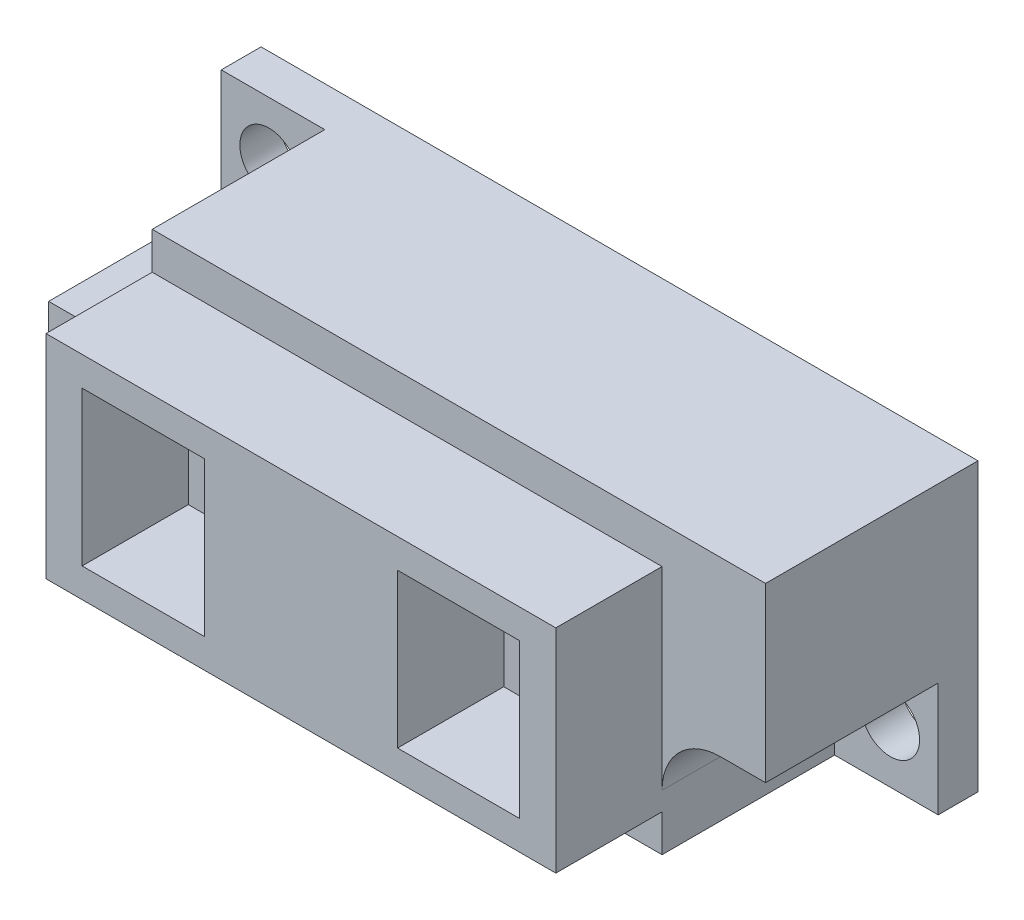
ISO-10303-21;
HEADER;
FILE_DESCRIPTION(('STEP AP214'),'2;1');
FILE_NAME('part.step','',(''),(''),'','','');
FILE_SCHEMA(('AUTOMOTIVE_DESIGN { 1 0 10303 214 1 1 1 1 }'));
ENDSEC;
DATA;
#1=APPLICATION_CONTEXT('core data for automotive mechanical design processes');
#2=APPLICATION_PROTOCOL_DEFINITION('international standard','automotive_design',2000,#1);
#3=PRODUCT_CONTEXT('',#1,'mechanical');
#4=PRODUCT('Part','Part','',(#3));
#5=PRODUCT_RELATED_PRODUCT_CATEGORY('part','',(#4));
#6=PRODUCT_DEFINITION_FORMATION('','',#4);
#7=PRODUCT_DEFINITION_CONTEXT('part definition',#1,'design');
#8=PRODUCT_DEFINITION('design','',#6,#7);
#9=PRODUCT_DEFINITION_SHAPE('','',#8);
#10=(LENGTH_UNIT() NAMED_UNIT(*) SI_UNIT(.MILLI.,.METRE.));
#11=(NAMED_UNIT(*) PLANE_ANGLE_UNIT() SI_UNIT($,.RADIAN.));
#12=(NAMED_UNIT(*) SI_UNIT($,.STERADIAN.) SOLID_ANGLE_UNIT());
#13=UNCERTAINTY_MEASURE_WITH_UNIT(LENGTH_MEASURE(1.E-05),#10,'distance_accuracy_value','');
#14=(GEOMETRIC_REPRESENTATION_CONTEXT(3) GLOBAL_UNCERTAINTY_ASSIGNED_CONTEXT((#13)) GLOBAL_UNIT_ASSIGNED_CONTEXT((#10,
#11,#12)) REPRESENTATION_CONTEXT('',''));
#15=CARTESIAN_POINT('',(0.,0.,0.));
#16=DIRECTION('',(0.,0.,1.));
#17=DIRECTION('',(1.,0.,0.));
#18=AXIS2_PLACEMENT_3D('',#15,#16,#17);
#19=CARTESIAN_POINT('',(0.,0.,12.));
#20=DIRECTION('',(0.,0.,-1.));
#21=DIRECTION('',(-1.,0.,0.));
#22=AXIS2_PLACEMENT_3D('',#19,#20,#21);
#23=PLANE('',#22);
#24=DIRECTION('',(-1.,0.,0.));
#25=VECTOR('',#24,1.);
#26=CARTESIAN_POINT('',(-8.24,2.9,12.));
#27=LINE('',#26,#25);
#28=CARTESIAN_POINT('',(-3.64,2.9,12.));
#29=VERTEX_POINT('',#28);
#30=CARTESIAN_POINT('',(-8.24,2.9,12.));
#31=VERTEX_POINT('',#30);
#32=EDGE_CURVE('E309',#29,#31,#27,.T.);
#33=ORIENTED_EDGE('',*,*,#32,.F.);
#34=DIRECTION('',(0.,1.,0.));
#35=VECTOR('',#34,1.);
#36=CARTESIAN_POINT('',(-3.64,-2.9,12.));
#37=LINE('',#36,#35);
#38=CARTESIAN_POINT('',(-3.64,-2.9,12.));
#39=VERTEX_POINT('',#38);
#40=EDGE_CURVE('E65',#39,#29,#37,.T.);
#41=ORIENTED_EDGE('',*,*,#40,.F.);
#42=DIRECTION('',(1.,0.,0.));
#43=VECTOR('',#42,1.);
#44=CARTESIAN_POINT('',(-8.24,-2.9,12.));
#45=LINE('',#44,#43);
#46=CARTESIAN_POINT('',(-8.24,-2.9,12.));
#47=VERTEX_POINT('',#46);
#48=EDGE_CURVE('E294',#47,#39,#45,.T.);
#49=ORIENTED_EDGE('',*,*,#48,.F.);
#50=DIRECTION('',(0.,-1.,0.));
#51=VECTOR('',#50,1.);
#52=CARTESIAN_POINT('',(-8.24,-2.9,12.));
#53=LINE('',#52,#51);
#54=EDGE_CURVE('E314',#31,#47,#53,.T.);
#55=ORIENTED_EDGE('',*,*,#54,.F.);
#56=EDGE_LOOP('',(#33,#41,#49,#55));
#57=FACE_BOUND('',#56,.T.);
#58=DIRECTION('',(-1.,0.,0.));
#59=VECTOR('',#58,1.);
#60=CARTESIAN_POINT('',(3.64,2.9,12.));
#61=LINE('',#60,#59);
#62=CARTESIAN_POINT('',(8.24,2.9,12.));
#63=VERTEX_POINT('',#62);
#64=CARTESIAN_POINT('',(3.64,2.9,12.));
#65=VERTEX_POINT('',#64);
#66=EDGE_CURVE('E353',#63,#65,#61,.T.);
#67=ORIENTED_EDGE('',*,*,#66,.F.);
#68=DIRECTION('',(0.,1.,0.));
#69=VECTOR('',#68,1.);
#70=CARTESIAN_POINT('',(8.24,-2.9,12.));
#71=LINE('',#70,#69);
#72=CARTESIAN_POINT('',(8.24,-2.9,12.));
#73=VERTEX_POINT('',#72);
#74=EDGE_CURVE('E281',#73,#63,#71,.T.);
#75=ORIENTED_EDGE('',*,*,#74,.F.);
#76=DIRECTION('',(1.,0.,0.));
#77=VECTOR('',#76,1.);
#78=CARTESIAN_POINT('',(3.64,-2.9,12.));
#79=LINE('',#78,#77);
#80=CARTESIAN_POINT('',(3.64,-2.9,12.));
#81=VERTEX_POINT('',#80);
#82=EDGE_CURVE('E338',#81,#73,#79,.T.);
#83=ORIENTED_EDGE('',*,*,#82,.F.);
#84=DIRECTION('',(0.,-1.,0.));
#85=VECTOR('',#84,1.);
#86=CARTESIAN_POINT('',(3.64,-2.9,12.));
#87=LINE('',#86,#85);
#88=EDGE_CURVE('E357',#65,#81,#87,.T.);
#89=ORIENTED_EDGE('',*,*,#88,.F.);
#90=EDGE_LOOP('',(#67,#75,#83,#89));
#91=FACE_BOUND('',#90,.T.);
#92=DIRECTION('',(1.,0.,0.));
#93=VECTOR('',#92,1.);
#94=CARTESIAN_POINT('',(-9.6,-4.,12.));
#95=LINE('',#94,#93);
#96=CARTESIAN_POINT('',(-9.6,-4.,12.));
#97=VERTEX_POINT('',#96);
#98=CARTESIAN_POINT('',(9.6,-4.,12.));
#99=VERTEX_POINT('',#98);
#100=EDGE_CURVE('E379',#97,#99,#95,.T.);
#101=ORIENTED_EDGE('',*,*,#100,.T.);
#102=DIRECTION('',(0.,-1.,0.));
#103=VECTOR('',#102,1.);
#104=CARTESIAN_POINT('',(9.6,-5.4,12.));
#105=LINE('',#104,#103);
#106=CARTESIAN_POINT('',(9.6,4.,12.));
#107=VERTEX_POINT('',#106);
#108=EDGE_CURVE('E441',#107,#99,#105,.T.);
#109=ORIENTED_EDGE('',*,*,#108,.F.);
#110=DIRECTION('',(-1.,0.,0.));
#111=VECTOR('',#110,1.);
#112=CARTESIAN_POINT('',(-9.6,4.,12.));
#113=LINE('',#112,#111);
#114=CARTESIAN_POINT('',(-9.6,4.,12.));
#115=VERTEX_POINT('',#114);
#116=EDGE_CURVE('E324',#107,#115,#113,.T.);
#117=ORIENTED_EDGE('',*,*,#116,.T.);
#118=DIRECTION('',(0.,1.,0.));
#119=VECTOR('',#118,1.);
#120=CARTESIAN_POINT('',(-9.59999999999999,5.4,12.));
#121=LINE('',#120,#119);
#122=EDGE_CURVE('E447',#97,#115,#121,.T.);
#123=ORIENTED_EDGE('',*,*,#122,.F.);
#124=EDGE_LOOP('',(#101,#109,#117,#123));
#125=FACE_BOUND('',#124,.T.);
#126=ADVANCED_FACE('F41',(#57,#91,#125),#23,.F.);
#127=CARTESIAN_POINT('',(-11.7,3.3,0.));
#128=DIRECTION('',(0.,0.,1.));
#129=DIRECTION('',(1.,0.,0.));
#130=AXIS2_PLACEMENT_3D('',#127,#128,#129);
#131=CYLINDRICAL_SURFACE('',#130,1.1);
#132=CARTESIAN_POINT('',(-11.7,3.3,0.));
#133=DIRECTION('',(0.,0.,1.));
#134=DIRECTION('',(1.,0.,0.));
#135=AXIS2_PLACEMENT_3D('',#132,#133,#134);
#136=CIRCLE('',#135,1.1);
#137=CARTESIAN_POINT('',(-10.6,3.3,0.));
#138=VERTEX_POINT('',#137);
#139=EDGE_CURVE('E520',#138,#138,#136,.T.);
#140=ORIENTED_EDGE('',*,*,#139,.F.);
#141=EDGE_LOOP('',(#140));
#142=FACE_BOUND('',#141,.T.);
#143=CARTESIAN_POINT('',(-11.7,3.3,1.5));
#144=DIRECTION('',(0.,0.,1.));
#145=DIRECTION('',(1.,0.,0.));
#146=AXIS2_PLACEMENT_3D('',#143,#144,#145);
#147=CIRCLE('',#146,1.1);
#148=CARTESIAN_POINT('',(-10.6,3.3,1.5));
#149=VERTEX_POINT('',#148);
#150=EDGE_CURVE('E471',#149,#149,#147,.F.);
#151=ORIENTED_EDGE('',*,*,#150,.F.);
#152=EDGE_LOOP('',(#151));
#153=FACE_BOUND('',#152,.T.);
#154=ADVANCED_FACE('F582',(#142,#153),#131,.F.);
#155=CARTESIAN_POINT('',(-13.5,-5.4,12.));
#156=DIRECTION('',(-1.,0.,0.));
#157=DIRECTION('',(0.,0.,1.));
#158=AXIS2_PLACEMENT_3D('',#155,#156,#157);
#159=PLANE('',#158);
#160=DIRECTION('',(0.,-1.,0.));
#161=VECTOR('',#160,1.);
#162=CARTESIAN_POINT('',(-13.5,-5.4,8.));
#163=LINE('',#162,#161);
#164=CARTESIAN_POINT('',(-13.5,1.1,8.));
#165=VERTEX_POINT('',#164);
#166=CARTESIAN_POINT('',(-13.5,-5.4,8.));
#167=VERTEX_POINT('',#166);
#168=EDGE_CURVE('E415',#165,#167,#163,.T.);
#169=ORIENTED_EDGE('',*,*,#168,.F.);
#170=DIRECTION('',(0.,0.,1.));
#171=VECTOR('',#170,1.);
#172=CARTESIAN_POINT('',(-13.5,1.1,1.5));
#173=LINE('',#172,#171);
#174=CARTESIAN_POINT('',(-13.5,1.1,1.5));
#175=VERTEX_POINT('',#174);
#176=EDGE_CURVE('E462',#175,#165,#173,.T.);
#177=ORIENTED_EDGE('',*,*,#176,.F.);
#178=DIRECTION('',(0.,-1.,0.));
#179=VECTOR('',#178,1.);
#180=CARTESIAN_POINT('',(-13.5,5.4,1.5));
#181=LINE('',#180,#179);
#182=CARTESIAN_POINT('',(-13.5,5.4,1.5));
#183=VERTEX_POINT('',#182);
#184=EDGE_CURVE('E442',#183,#175,#181,.T.);
#185=ORIENTED_EDGE('',*,*,#184,.F.);
#186=DIRECTION('',(0.,0.,-1.));
#187=VECTOR('',#186,1.);
#188=CARTESIAN_POINT('',(-13.5,5.4,12.));
#189=LINE('',#188,#187);
#190=CARTESIAN_POINT('',(-13.5,5.4,0.));
#191=VERTEX_POINT('',#190);
#192=EDGE_CURVE('E543',#183,#191,#189,.T.);
#193=ORIENTED_EDGE('',*,*,#192,.T.);
#194=DIRECTION('',(0.,1.,0.));
#195=VECTOR('',#194,1.);
#196=CARTESIAN_POINT('',(-13.5,-5.4,0.));
#197=LINE('',#196,#195);
#198=CARTESIAN_POINT('',(-13.5,-5.4,0.));
#199=VERTEX_POINT('',#198);
#200=EDGE_CURVE('E237',#199,#191,#197,.T.);
#201=ORIENTED_EDGE('',*,*,#200,.F.);
#202=DIRECTION('',(0.,0.,-1.));
#203=VECTOR('',#202,1.);
#204=CARTESIAN_POINT('',(-13.5,-5.4,4.));
#205=LINE('',#204,#203);
#206=CARTESIAN_POINT('',(-13.5,-5.4,-2.6));
#207=VERTEX_POINT('',#206);
#208=EDGE_CURVE('E231',#199,#207,#205,.T.);
#209=ORIENTED_EDGE('',*,*,#208,.T.);
#210=DIRECTION('',(0.,1.,0.));
#211=VECTOR('',#210,1.);
#212=CARTESIAN_POINT('',(-13.5,-5.4,-2.6));
#213=LINE('',#212,#211);
#214=CARTESIAN_POINT('',(-13.5,-7.8,-2.6));
#215=VERTEX_POINT('',#214);
#216=EDGE_CURVE('E235',#215,#207,#213,.T.);
#217=ORIENTED_EDGE('',*,*,#216,.F.);
#218=DIRECTION('',(0.,0.,-1.));
#219=VECTOR('',#218,1.);
#220=CARTESIAN_POINT('',(-13.5,-7.8,4.));
#221=LINE('',#220,#219);
#222=CARTESIAN_POINT('',(-13.5,-7.8,4.));
#223=VERTEX_POINT('',#222);
#224=EDGE_CURVE('E278',#223,#215,#221,.T.);
#225=ORIENTED_EDGE('',*,*,#224,.F.);
#226=DIRECTION('',(0.,1.,0.));
#227=VECTOR('',#226,1.);
#228=CARTESIAN_POINT('',(-13.5,-5.4,4.));
#229=LINE('',#228,#227);
#230=CARTESIAN_POINT('',(-13.5,-5.4,4.));
#231=VERTEX_POINT('',#230);
#232=EDGE_CURVE('E265',#223,#231,#229,.T.);
#233=ORIENTED_EDGE('',*,*,#232,.T.);
#234=DIRECTION('',(0.,0.,-1.));
#235=VECTOR('',#234,1.);
#236=CARTESIAN_POINT('',(-13.5,-5.4,12.));
#237=LINE('',#236,#235);
#238=EDGE_CURVE('E50',#167,#231,#237,.T.);
#239=ORIENTED_EDGE('',*,*,#238,.F.);
#240=EDGE_LOOP('',(#169,#177,#185,#193,#201,#209,#217,#225,#233,#239));
#241=FACE_BOUND('',#240,.T.);
#242=ADVANCED_FACE('F43',(#241),#159,.T.);
#243=CARTESIAN_POINT('',(-13.5,-5.4,12.));
#244=DIRECTION('',(0.,1.,0.));
#245=DIRECTION('',(0.,0.,1.));
#246=AXIS2_PLACEMENT_3D('',#243,#244,#245);
#247=PLANE('',#246);
#248=DIRECTION('',(1.,0.,0.));
#249=VECTOR('',#248,1.);
#250=CARTESIAN_POINT('',(-13.5,-5.4,4.));
#251=LINE('',#250,#249);
#252=CARTESIAN_POINT('',(-3.65,-5.4,4.));
#253=VERTEX_POINT('',#252);
#254=EDGE_CURVE('E269',#231,#253,#251,.T.);
#255=ORIENTED_EDGE('',*,*,#254,.T.);
#256=DIRECTION('',(0.,0.,-1.));
#257=VECTOR('',#256,1.);
#258=CARTESIAN_POINT('',(-3.65,-5.4,4.));
#259=LINE('',#258,#257);
#260=CARTESIAN_POINT('',(-3.65,-5.4,0.));
#261=VERTEX_POINT('',#260);
#262=EDGE_CURVE('E285',#253,#261,#259,.T.);
#263=ORIENTED_EDGE('',*,*,#262,.T.);
#264=DIRECTION('',(1.,0.,0.));
#265=VECTOR('',#264,1.);
#266=CARTESIAN_POINT('',(-13.5,-5.4,0.));
#267=LINE('',#266,#265);
#268=CARTESIAN_POINT('',(13.5,-5.4,0.));
#269=VERTEX_POINT('',#268);
#270=EDGE_CURVE('E539',#261,#269,#267,.T.);
#271=ORIENTED_EDGE('',*,*,#270,.T.);
#272=DIRECTION('',(0.,0.,-1.));
#273=VECTOR('',#272,1.);
#274=CARTESIAN_POINT('',(13.5,-5.4,12.));
#275=LINE('',#274,#273);
#276=CARTESIAN_POINT('',(13.5,-5.4,1.5));
#277=VERTEX_POINT('',#276);
#278=EDGE_CURVE('E547',#277,#269,#275,.T.);
#279=ORIENTED_EDGE('',*,*,#278,.F.);
#280=DIRECTION('',(1.,0.,0.));
#281=VECTOR('',#280,1.);
#282=CARTESIAN_POINT('',(9.6,-5.4,1.5));
#283=LINE('',#282,#281);
#284=CARTESIAN_POINT('',(9.6,-5.4,1.5));
#285=VERTEX_POINT('',#284);
#286=EDGE_CURVE('E499',#285,#277,#283,.T.);
#287=ORIENTED_EDGE('',*,*,#286,.F.);
#288=DIRECTION('',(0.,0.,1.));
#289=VECTOR('',#288,1.);
#290=CARTESIAN_POINT('',(9.6,-5.4,1.5));
#291=LINE('',#290,#289);
#292=CARTESIAN_POINT('',(9.6,-5.4,8.));
#293=VERTEX_POINT('',#292);
#294=EDGE_CURVE('E466',#285,#293,#291,.T.);
#295=ORIENTED_EDGE('',*,*,#294,.T.);
#296=DIRECTION('',(1.,0.,0.));
#297=VECTOR('',#296,1.);
#298=CARTESIAN_POINT('',(-13.5,-5.4,8.));
#299=LINE('',#298,#297);
#300=EDGE_CURVE('E418',#167,#293,#299,.T.);
#301=ORIENTED_EDGE('',*,*,#300,.F.);
#302=ORIENTED_EDGE('',*,*,#238,.T.);
#303=EDGE_LOOP('',(#255,#263,#271,#279,#287,#295,#301,#302));
#304=FACE_BOUND('',#303,.T.);
#305=ADVANCED_FACE('F599',(#304),#247,.F.);
#306=CARTESIAN_POINT('',(13.5,-5.4,12.));
#307=DIRECTION('',(-1.,0.,0.));
#308=DIRECTION('',(0.,0.,1.));
#309=AXIS2_PLACEMENT_3D('',#306,#307,#308);
#310=PLANE('',#309);
#311=DIRECTION('',(0.,0.,-1.));
#312=VECTOR('',#311,1.);
#313=CARTESIAN_POINT('',(13.5,5.4,12.));
#314=LINE('',#313,#312);
#315=CARTESIAN_POINT('',(13.5,5.4,8.));
#316=VERTEX_POINT('',#315);
#317=CARTESIAN_POINT('',(13.5,5.4,0.));
#318=VERTEX_POINT('',#317);
#319=EDGE_CURVE('E551',#316,#318,#314,.T.);
#320=ORIENTED_EDGE('',*,*,#319,.F.);
#321=DIRECTION('',(0.,1.,0.));
#322=VECTOR('',#321,1.);
#323=CARTESIAN_POINT('',(13.5,-5.4,8.));
#324=LINE('',#323,#322);
#325=CARTESIAN_POINT('',(13.5,-1.1,8.));
#326=VERTEX_POINT('',#325);
#327=EDGE_CURVE('E399',#326,#316,#324,.T.);
#328=ORIENTED_EDGE('',*,*,#327,.F.);
#329=DIRECTION('',(0.,0.,1.));
#330=VECTOR('',#329,1.);
#331=CARTESIAN_POINT('',(13.5,-1.1,1.5));
#332=LINE('',#331,#330);
#333=CARTESIAN_POINT('',(13.5,-1.1,1.5));
#334=VERTEX_POINT('',#333);
#335=EDGE_CURVE('E502',#334,#326,#332,.T.);
#336=ORIENTED_EDGE('',*,*,#335,.F.);
#337=DIRECTION('',(0.,1.,0.));
#338=VECTOR('',#337,1.);
#339=CARTESIAN_POINT('',(13.5,-1.1,1.5));
#340=LINE('',#339,#338);
#341=EDGE_CURVE('E483',#277,#334,#340,.T.);
#342=ORIENTED_EDGE('',*,*,#341,.F.);
#343=ORIENTED_EDGE('',*,*,#278,.T.);
#344=DIRECTION('',(0.,1.,0.));
#345=VECTOR('',#344,1.);
#346=CARTESIAN_POINT('',(13.5,-5.4,0.));
#347=LINE('',#346,#345);
#348=EDGE_CURVE('E535',#269,#318,#347,.T.);
#349=ORIENTED_EDGE('',*,*,#348,.T.);
#350=EDGE_LOOP('',(#320,#328,#336,#342,#343,#349));
#351=FACE_BOUND('',#350,.T.);
#352=ADVANCED_FACE('F602',(#351),#310,.F.);
#353=CARTESIAN_POINT('',(-13.5,5.4,12.));
#354=DIRECTION('',(0.,1.,0.));
#355=DIRECTION('',(0.,0.,1.));
#356=AXIS2_PLACEMENT_3D('',#353,#354,#355);
#357=PLANE('',#356);
#358=DIRECTION('',(-1.,0.,0.));
#359=VECTOR('',#358,1.);
#360=CARTESIAN_POINT('',(-13.5,5.4,8.));
#361=LINE('',#360,#359);
#362=CARTESIAN_POINT('',(-9.59999999999999,5.4,8.));
#363=VERTEX_POINT('',#362);
#364=EDGE_CURVE('E412',#316,#363,#361,.T.);
#365=ORIENTED_EDGE('',*,*,#364,.F.);
#366=ORIENTED_EDGE('',*,*,#319,.T.);
#367=DIRECTION('',(1.,0.,0.));
#368=VECTOR('',#367,1.);
#369=CARTESIAN_POINT('',(-13.5,5.4,0.));
#370=LINE('',#369,#368);
#371=EDGE_CURVE('E531',#191,#318,#370,.T.);
#372=ORIENTED_EDGE('',*,*,#371,.F.);
#373=ORIENTED_EDGE('',*,*,#192,.F.);
#374=DIRECTION('',(-1.,0.,0.));
#375=VECTOR('',#374,1.);
#376=CARTESIAN_POINT('',(-9.59999999999999,5.4,1.5));
#377=LINE('',#376,#375);
#378=CARTESIAN_POINT('',(-9.59999999999999,5.4,1.5));
#379=VERTEX_POINT('',#378);
#380=EDGE_CURVE('E459',#379,#183,#377,.T.);
#381=ORIENTED_EDGE('',*,*,#380,.F.);
#382=DIRECTION('',(0.,0.,1.));
#383=VECTOR('',#382,1.);
#384=CARTESIAN_POINT('',(-9.59999999999999,5.4,1.5));
#385=LINE('',#384,#383);
#386=EDGE_CURVE('E467',#379,#363,#385,.T.);
#387=ORIENTED_EDGE('',*,*,#386,.T.);
#388=EDGE_LOOP('',(#365,#366,#372,#373,#381,#387));
#389=FACE_BOUND('',#388,.T.);
#390=ADVANCED_FACE('F597',(#389),#357,.T.);
#391=CARTESIAN_POINT('',(0.,0.,0.));
#392=DIRECTION('',(0.,0.,-1.));
#393=DIRECTION('',(-1.,0.,0.));
#394=AXIS2_PLACEMENT_3D('',#391,#392,#393);
#395=PLANE('',#394);
#396=ORIENTED_EDGE('',*,*,#139,.T.);
#397=EDGE_LOOP('',(#396));
#398=FACE_BOUND('',#397,.T.);
#399=CARTESIAN_POINT('',(11.7,-3.3,0.));
#400=DIRECTION('',(0.,0.,1.));
#401=DIRECTION('',(1.,0.,0.));
#402=AXIS2_PLACEMENT_3D('',#399,#400,#401);
#403=CIRCLE('',#402,1.1);
#404=CARTESIAN_POINT('',(12.8,-3.3,0.));
#405=VERTEX_POINT('',#404);
#406=EDGE_CURVE('E524',#405,#405,#403,.T.);
#407=ORIENTED_EDGE('',*,*,#406,.T.);
#408=EDGE_LOOP('',(#407));
#409=FACE_BOUND('',#408,.T.);
#410=ORIENTED_EDGE('',*,*,#200,.T.);
#411=ORIENTED_EDGE('',*,*,#371,.T.);
#412=ORIENTED_EDGE('',*,*,#348,.F.);
#413=ORIENTED_EDGE('',*,*,#270,.F.);
#414=EDGE_CURVE('E540',#199,#261,#267,.T.);
#415=ORIENTED_EDGE('',*,*,#414,.F.);
#416=EDGE_LOOP('',(#410,#411,#412,#413,#415));
#417=FACE_BOUND('',#416,.T.);
#418=ADVANCED_FACE('F594',(#398,#409,#417),#395,.T.);
#419=CARTESIAN_POINT('',(11.7,-3.3,0.));
#420=DIRECTION('',(0.,0.,1.));
#421=DIRECTION('',(1.,0.,0.));
#422=AXIS2_PLACEMENT_3D('',#419,#420,#421);
#423=CYLINDRICAL_SURFACE('',#422,1.1);
#424=CARTESIAN_POINT('',(11.7,-3.3,1.5));
#425=DIRECTION('',(0.,0.,-1.));
#426=DIRECTION('',(-1.,0.,0.));
#427=AXIS2_PLACEMENT_3D('',#424,#425,#426);
#428=CIRCLE('',#427,1.1);
#429=CARTESIAN_POINT('',(10.6,-3.3,1.5));
#430=VERTEX_POINT('',#429);
#431=EDGE_CURVE('E528',#430,#430,#428,.F.);
#432=ORIENTED_EDGE('',*,*,#431,.T.);
#433=EDGE_LOOP('',(#432));
#434=FACE_BOUND('',#433,.T.);
#435=ORIENTED_EDGE('',*,*,#406,.F.);
#436=EDGE_LOOP('',(#435));
#437=FACE_BOUND('',#436,.T.);
#438=ADVANCED_FACE('F562',(#434,#437),#423,.F.);
#439=CARTESIAN_POINT('',(-11.8,3.3,1.5));
#440=DIRECTION('',(0.,0.,1.));
#441=DIRECTION('',(1.,0.,0.));
#442=AXIS2_PLACEMENT_3D('',#439,#440,#441);
#443=PLANE('',#442);
#444=ORIENTED_EDGE('',*,*,#184,.T.);
#445=DIRECTION('',(1.,0.,0.));
#446=VECTOR('',#445,1.);
#447=CARTESIAN_POINT('',(-13.5,1.1,1.5));
#448=LINE('',#447,#446);
#449=CARTESIAN_POINT('',(-11.8,1.1,1.5));
#450=VERTEX_POINT('',#449);
#451=EDGE_CURVE('E446',#175,#450,#448,.T.);
#452=ORIENTED_EDGE('',*,*,#451,.T.);
#453=CARTESIAN_POINT('',(-11.8,3.3,1.5));
#454=DIRECTION('',(0.,0.,1.));
#455=DIRECTION('',(1.,0.,0.));
#456=AXIS2_PLACEMENT_3D('',#453,#454,#455);
#457=CIRCLE('',#456,2.2);
#458=CARTESIAN_POINT('',(-9.59999999999999,3.30000000000002,1.5));
#459=VERTEX_POINT('',#458);
#460=EDGE_CURVE('E451',#450,#459,#457,.T.);
#461=ORIENTED_EDGE('',*,*,#460,.T.);
#462=DIRECTION('',(0.,1.,0.));
#463=VECTOR('',#462,1.);
#464=CARTESIAN_POINT('',(-9.59999999999999,5.4,1.5));
#465=LINE('',#464,#463);
#466=EDGE_CURVE('E455',#459,#379,#465,.T.);
#467=ORIENTED_EDGE('',*,*,#466,.T.);
#468=ORIENTED_EDGE('',*,*,#380,.T.);
#469=EDGE_LOOP('',(#444,#452,#461,#467,#468));
#470=FACE_BOUND('',#469,.T.);
#471=ORIENTED_EDGE('',*,*,#150,.T.);
#472=EDGE_LOOP('',(#471));
#473=FACE_BOUND('',#472,.T.);
#474=ADVANCED_FACE('F626',(#470,#473),#443,.T.);
#475=CARTESIAN_POINT('',(-9.59999999999999,5.4,1.5));
#476=DIRECTION('',(1.,0.,0.));
#477=DIRECTION('',(0.,0.,-1.));
#478=AXIS2_PLACEMENT_3D('',#475,#476,#477);
#479=PLANE('',#478);
#480=DIRECTION('',(0.,0.,1.));
#481=VECTOR('',#480,1.);
#482=CARTESIAN_POINT('',(-9.59999999999999,3.30000000000002,1.5));
#483=LINE('',#482,#481);
#484=CARTESIAN_POINT('',(-9.6,3.3,8.));
#485=VERTEX_POINT('',#484);
#486=EDGE_CURVE('E472',#459,#485,#483,.T.);
#487=ORIENTED_EDGE('',*,*,#486,.T.);
#488=DIRECTION('',(0.,-1.,0.));
#489=VECTOR('',#488,1.);
#490=CARTESIAN_POINT('',(-9.6,-4.,8.));
#491=LINE('',#490,#489);
#492=CARTESIAN_POINT('',(-9.6,-4.,8.));
#493=VERTEX_POINT('',#492);
#494=EDGE_CURVE('E383',#485,#493,#491,.T.);
#495=ORIENTED_EDGE('',*,*,#494,.T.);
#496=DIRECTION('',(0.,0.,1.));
#497=VECTOR('',#496,1.);
#498=CARTESIAN_POINT('',(-9.6,-4.,8.));
#499=LINE('',#498,#497);
#500=EDGE_CURVE('E400',#493,#97,#499,.T.);
#501=ORIENTED_EDGE('',*,*,#500,.T.);
#502=ORIENTED_EDGE('',*,*,#122,.T.);
#503=DIRECTION('',(0.,0.,1.));
#504=VECTOR('',#503,1.);
#505=CARTESIAN_POINT('',(-9.6,4.,8.));
#506=LINE('',#505,#504);
#507=CARTESIAN_POINT('',(-9.6,4.,8.));
#508=VERTEX_POINT('',#507);
#509=EDGE_CURVE('E404',#508,#115,#506,.T.);
#510=ORIENTED_EDGE('',*,*,#509,.F.);
#511=DIRECTION('',(0.,1.,0.));
#512=VECTOR('',#511,1.);
#513=CARTESIAN_POINT('',(-9.59999999999999,5.4,8.));
#514=LINE('',#513,#512);
#515=EDGE_CURVE('E437',#508,#363,#514,.T.);
#516=ORIENTED_EDGE('',*,*,#515,.T.);
#517=ORIENTED_EDGE('',*,*,#386,.F.);
#518=ORIENTED_EDGE('',*,*,#466,.F.);
#519=EDGE_LOOP('',(#487,#495,#501,#502,#510,#516,#517,#518));
#520=FACE_BOUND('',#519,.T.);
#521=ADVANCED_FACE('F631',(#520),#479,.F.);
#522=CARTESIAN_POINT('',(-11.8,3.3,1.5));
#523=DIRECTION('',(0.,0.,1.));
#524=DIRECTION('',(1.,0.,0.));
#525=AXIS2_PLACEMENT_3D('',#522,#523,#524);
#526=CYLINDRICAL_SURFACE('',#525,2.2);
#527=DIRECTION('',(0.,0.,1.));
#528=VECTOR('',#527,1.);
#529=CARTESIAN_POINT('',(-11.8,1.1,1.5));
#530=LINE('',#529,#528);
#531=CARTESIAN_POINT('',(-11.8,1.1,8.));
#532=VERTEX_POINT('',#531);
#533=EDGE_CURVE('E476',#450,#532,#530,.T.);
#534=ORIENTED_EDGE('',*,*,#533,.T.);
#535=CARTESIAN_POINT('',(-11.8,3.3,8.));
#536=DIRECTION('',(0.,0.,-1.));
#537=DIRECTION('',(-1.,0.,0.));
#538=AXIS2_PLACEMENT_3D('',#535,#536,#537);
#539=CIRCLE('',#538,2.2);
#540=EDGE_CURVE('E433',#532,#485,#539,.F.);
#541=ORIENTED_EDGE('',*,*,#540,.T.);
#542=ORIENTED_EDGE('',*,*,#486,.F.);
#543=ORIENTED_EDGE('',*,*,#460,.F.);
#544=EDGE_LOOP('',(#534,#541,#542,#543));
#545=FACE_BOUND('',#544,.T.);
#546=ADVANCED_FACE('F578',(#545),#526,.F.);
#547=CARTESIAN_POINT('',(-13.5,1.1,1.5));
#548=DIRECTION('',(0.,-1.,0.));
#549=DIRECTION('',(0.,0.,-1.));
#550=AXIS2_PLACEMENT_3D('',#547,#548,#549);
#551=PLANE('',#550);
#552=ORIENTED_EDGE('',*,*,#176,.T.);
#553=DIRECTION('',(1.,0.,0.));
#554=VECTOR('',#553,1.);
#555=CARTESIAN_POINT('',(-13.5,1.1,8.));
#556=LINE('',#555,#554);
#557=EDGE_CURVE('E429',#165,#532,#556,.T.);
#558=ORIENTED_EDGE('',*,*,#557,.T.);
#559=ORIENTED_EDGE('',*,*,#533,.F.);
#560=ORIENTED_EDGE('',*,*,#451,.F.);
#561=EDGE_LOOP('',(#552,#558,#559,#560));
#562=FACE_BOUND('',#561,.T.);
#563=ADVANCED_FACE('F568',(#562),#551,.F.);
#564=CARTESIAN_POINT('',(11.8,-3.3,1.5));
#565=DIRECTION('',(0.,0.,-1.));
#566=DIRECTION('',(-1.,0.,0.));
#567=AXIS2_PLACEMENT_3D('',#564,#565,#566);
#568=PLANE('',#567);
#569=ORIENTED_EDGE('',*,*,#341,.T.);
#570=DIRECTION('',(-1.,0.,0.));
#571=VECTOR('',#570,1.);
#572=CARTESIAN_POINT('',(13.5,-1.1,1.5));
#573=LINE('',#572,#571);
#574=CARTESIAN_POINT('',(11.8,-1.1,1.5));
#575=VERTEX_POINT('',#574);
#576=EDGE_CURVE('E487',#334,#575,#573,.T.);
#577=ORIENTED_EDGE('',*,*,#576,.T.);
#578=CARTESIAN_POINT('',(11.8,-3.3,1.5));
#579=DIRECTION('',(0.,0.,1.));
#580=DIRECTION('',(-1.,0.,0.));
#581=AXIS2_PLACEMENT_3D('',#578,#579,#580);
#582=CIRCLE('',#581,2.2);
#583=CARTESIAN_POINT('',(9.6,-3.3,1.5));
#584=VERTEX_POINT('',#583);
#585=EDGE_CURVE('E491',#575,#584,#582,.T.);
#586=ORIENTED_EDGE('',*,*,#585,.T.);
#587=DIRECTION('',(0.,-1.,0.));
#588=VECTOR('',#587,1.);
#589=CARTESIAN_POINT('',(9.6,-5.4,1.5));
#590=LINE('',#589,#588);
#591=EDGE_CURVE('E495',#584,#285,#590,.T.);
#592=ORIENTED_EDGE('',*,*,#591,.T.);
#593=ORIENTED_EDGE('',*,*,#286,.T.);
#594=EDGE_LOOP('',(#569,#577,#586,#592,#593));
#595=FACE_BOUND('',#594,.T.);
#596=ORIENTED_EDGE('',*,*,#431,.F.);
#597=EDGE_LOOP('',(#596));
#598=FACE_BOUND('',#597,.T.);
#599=ADVANCED_FACE('F565',(#595,#598),#568,.F.);
#600=CARTESIAN_POINT('',(9.6,-5.4,1.5));
#601=DIRECTION('',(-1.,0.,0.));
#602=DIRECTION('',(0.,0.,1.));
#603=AXIS2_PLACEMENT_3D('',#600,#601,#602);
#604=PLANE('',#603);
#605=DIRECTION('',(0.,0.,1.));
#606=VECTOR('',#605,1.);
#607=CARTESIAN_POINT('',(9.6,-3.3,1.5));
#608=LINE('',#607,#606);
#609=CARTESIAN_POINT('',(9.6,-3.3,8.));
#610=VERTEX_POINT('',#609);
#611=EDGE_CURVE('E509',#584,#610,#608,.T.);
#612=ORIENTED_EDGE('',*,*,#611,.T.);
#613=DIRECTION('',(0.,1.,0.));
#614=VECTOR('',#613,1.);
#615=CARTESIAN_POINT('',(9.6,-4.,8.));
#616=LINE('',#615,#614);
#617=CARTESIAN_POINT('',(9.6,4.,8.));
#618=VERTEX_POINT('',#617);
#619=EDGE_CURVE('E375',#610,#618,#616,.T.);
#620=ORIENTED_EDGE('',*,*,#619,.T.);
#621=DIRECTION('',(0.,0.,1.));
#622=VECTOR('',#621,1.);
#623=CARTESIAN_POINT('',(9.6,4.,8.));
#624=LINE('',#623,#622);
#625=EDGE_CURVE('E389',#618,#107,#624,.T.);
#626=ORIENTED_EDGE('',*,*,#625,.T.);
#627=ORIENTED_EDGE('',*,*,#108,.T.);
#628=DIRECTION('',(0.,0.,1.));
#629=VECTOR('',#628,1.);
#630=CARTESIAN_POINT('',(9.6,-4.,8.));
#631=LINE('',#630,#629);
#632=CARTESIAN_POINT('',(9.6,-4.,8.));
#633=VERTEX_POINT('',#632);
#634=EDGE_CURVE('E396',#633,#99,#631,.T.);
#635=ORIENTED_EDGE('',*,*,#634,.F.);
#636=DIRECTION('',(0.,-1.,0.));
#637=VECTOR('',#636,1.);
#638=CARTESIAN_POINT('',(9.6,-5.4,8.));
#639=LINE('',#638,#637);
#640=EDGE_CURVE('E425',#633,#293,#639,.T.);
#641=ORIENTED_EDGE('',*,*,#640,.T.);
#642=ORIENTED_EDGE('',*,*,#294,.F.);
#643=ORIENTED_EDGE('',*,*,#591,.F.);
#644=EDGE_LOOP('',(#612,#620,#626,#627,#635,#641,#642,#643));
#645=FACE_BOUND('',#644,.T.);
#646=ADVANCED_FACE('F567',(#645),#604,.F.);
#647=CARTESIAN_POINT('',(11.8,-3.3,1.5));
#648=DIRECTION('',(0.,0.,1.));
#649=DIRECTION('',(1.,0.,0.));
#650=AXIS2_PLACEMENT_3D('',#647,#648,#649);
#651=CYLINDRICAL_SURFACE('',#650,2.2);
#652=DIRECTION('',(0.,0.,1.));
#653=VECTOR('',#652,1.);
#654=CARTESIAN_POINT('',(11.8,-1.1,1.5));
#655=LINE('',#654,#653);
#656=CARTESIAN_POINT('',(11.8,-1.1,8.));
#657=VERTEX_POINT('',#656);
#658=EDGE_CURVE('E513',#575,#657,#655,.T.);
#659=ORIENTED_EDGE('',*,*,#658,.T.);
#660=CARTESIAN_POINT('',(11.8,-3.3,8.));
#661=DIRECTION('',(0.,0.,-1.));
#662=DIRECTION('',(-1.,0.,0.));
#663=AXIS2_PLACEMENT_3D('',#660,#661,#662);
#664=CIRCLE('',#663,2.2);
#665=EDGE_CURVE('E421',#657,#610,#664,.F.);
#666=ORIENTED_EDGE('',*,*,#665,.T.);
#667=ORIENTED_EDGE('',*,*,#611,.F.);
#668=ORIENTED_EDGE('',*,*,#585,.F.);
#669=EDGE_LOOP('',(#659,#666,#667,#668));
#670=FACE_BOUND('',#669,.T.);
#671=ADVANCED_FACE('F575',(#670),#651,.F.);
#672=CARTESIAN_POINT('',(13.5,-1.1,1.5));
#673=DIRECTION('',(0.,1.,0.));
#674=DIRECTION('',(0.,0.,1.));
#675=AXIS2_PLACEMENT_3D('',#672,#673,#674);
#676=PLANE('',#675);
#677=ORIENTED_EDGE('',*,*,#335,.T.);
#678=DIRECTION('',(-1.,0.,0.));
#679=VECTOR('',#678,1.);
#680=CARTESIAN_POINT('',(13.5,-1.1,8.));
#681=LINE('',#680,#679);
#682=EDGE_CURVE('E11',#326,#657,#681,.T.);
#683=ORIENTED_EDGE('',*,*,#682,.T.);
#684=ORIENTED_EDGE('',*,*,#658,.F.);
#685=ORIENTED_EDGE('',*,*,#576,.F.);
#686=EDGE_LOOP('',(#677,#683,#684,#685));
#687=FACE_BOUND('',#686,.T.);
#688=ADVANCED_FACE('F644',(#687),#676,.F.);
#689=CARTESIAN_POINT('',(0.,0.,8.));
#690=DIRECTION('',(0.,0.,-1.));
#691=DIRECTION('',(-1.,0.,0.));
#692=AXIS2_PLACEMENT_3D('',#689,#690,#691);
#693=PLANE('',#692);
#694=DIRECTION('',(-1.,0.,0.));
#695=VECTOR('',#694,1.);
#696=CARTESIAN_POINT('',(-9.6,4.,8.));
#697=LINE('',#696,#695);
#698=EDGE_CURVE('E378',#618,#508,#697,.T.);
#699=ORIENTED_EDGE('',*,*,#698,.F.);
#700=ORIENTED_EDGE('',*,*,#619,.F.);
#701=ORIENTED_EDGE('',*,*,#665,.F.);
#702=ORIENTED_EDGE('',*,*,#682,.F.);
#703=ORIENTED_EDGE('',*,*,#327,.T.);
#704=ORIENTED_EDGE('',*,*,#364,.T.);
#705=ORIENTED_EDGE('',*,*,#515,.F.);
#706=EDGE_LOOP('',(#699,#700,#701,#702,#703,#704,#705));
#707=FACE_BOUND('',#706,.T.);
#708=ADVANCED_FACE('F634',(#707),#693,.F.);
#709=CARTESIAN_POINT('',(-9.6,4.,8.));
#710=DIRECTION('',(0.,1.,0.));
#711=DIRECTION('',(0.,0.,1.));
#712=AXIS2_PLACEMENT_3D('',#709,#710,#711);
#713=PLANE('',#712);
#714=ORIENTED_EDGE('',*,*,#116,.F.);
#715=ORIENTED_EDGE('',*,*,#625,.F.);
#716=ORIENTED_EDGE('',*,*,#698,.T.);
#717=ORIENTED_EDGE('',*,*,#509,.T.);
#718=EDGE_LOOP('',(#714,#715,#716,#717));
#719=FACE_BOUND('',#718,.T.);
#720=ADVANCED_FACE('F638',(#719),#713,.T.);
#721=ORIENTED_EDGE('',*,*,#557,.F.);
#722=ORIENTED_EDGE('',*,*,#168,.T.);
#723=ORIENTED_EDGE('',*,*,#300,.T.);
#724=ORIENTED_EDGE('',*,*,#640,.F.);
#725=DIRECTION('',(1.,0.,0.));
#726=VECTOR('',#725,1.);
#727=CARTESIAN_POINT('',(-9.6,-4.,8.));
#728=LINE('',#727,#726);
#729=EDGE_CURVE('E386',#493,#633,#728,.T.);
#730=ORIENTED_EDGE('',*,*,#729,.F.);
#731=ORIENTED_EDGE('',*,*,#494,.F.);
#732=ORIENTED_EDGE('',*,*,#540,.F.);
#733=EDGE_LOOP('',(#721,#722,#723,#724,#730,#731,#732));
#734=FACE_BOUND('',#733,.T.);
#735=ADVANCED_FACE('F658',(#734),#693,.F.);
#736=CARTESIAN_POINT('',(-9.6,-4.,8.));
#737=DIRECTION('',(0.,-1.,0.));
#738=DIRECTION('',(0.,0.,-1.));
#739=AXIS2_PLACEMENT_3D('',#736,#737,#738);
#740=PLANE('',#739);
#741=ORIENTED_EDGE('',*,*,#100,.F.);
#742=ORIENTED_EDGE('',*,*,#500,.F.);
#743=ORIENTED_EDGE('',*,*,#729,.T.);
#744=ORIENTED_EDGE('',*,*,#634,.T.);
#745=EDGE_LOOP('',(#741,#742,#743,#744));
#746=FACE_BOUND('',#745,.T.);
#747=ADVANCED_FACE('F664',(#746),#740,.T.);
#748=CARTESIAN_POINT('',(8.24,-2.9,8.));
#749=DIRECTION('',(1.,0.,0.));
#750=DIRECTION('',(0.,1.,0.));
#751=AXIS2_PLACEMENT_3D('',#748,#749,#750);
#752=PLANE('',#751);
#753=ORIENTED_EDGE('',*,*,#74,.T.);
#754=DIRECTION('',(0.,0.,1.));
#755=VECTOR('',#754,1.);
#756=CARTESIAN_POINT('',(8.24,2.9,8.));
#757=LINE('',#756,#755);
#758=CARTESIAN_POINT('',(8.24,2.9,8.));
#759=VERTEX_POINT('',#758);
#760=EDGE_CURVE('E350',#759,#63,#757,.T.);
#761=ORIENTED_EDGE('',*,*,#760,.F.);
#762=DIRECTION('',(0.,1.,0.));
#763=VECTOR('',#762,1.);
#764=CARTESIAN_POINT('',(8.24,-2.9,8.));
#765=LINE('',#764,#763);
#766=CARTESIAN_POINT('',(8.24,-2.9,8.));
#767=VERTEX_POINT('',#766);
#768=EDGE_CURVE('E333',#767,#759,#765,.T.);
#769=ORIENTED_EDGE('',*,*,#768,.F.);
#770=DIRECTION('',(0.,0.,1.));
#771=VECTOR('',#770,1.);
#772=CARTESIAN_POINT('',(8.24,-2.9,8.));
#773=LINE('',#772,#771);
#774=EDGE_CURVE('E310',#767,#73,#773,.T.);
#775=ORIENTED_EDGE('',*,*,#774,.T.);
#776=EDGE_LOOP('',(#753,#761,#769,#775));
#777=FACE_BOUND('',#776,.T.);
#778=ADVANCED_FACE('F667',(#777),#752,.F.);
#779=CARTESIAN_POINT('',(3.64,-2.9,8.));
#780=DIRECTION('',(0.,-1.,0.));
#781=DIRECTION('',(1.,0.,0.));
#782=AXIS2_PLACEMENT_3D('',#779,#780,#781);
#783=PLANE('',#782);
#784=ORIENTED_EDGE('',*,*,#82,.T.);
#785=ORIENTED_EDGE('',*,*,#774,.F.);
#786=DIRECTION('',(1.,0.,0.));
#787=VECTOR('',#786,1.);
#788=CARTESIAN_POINT('',(3.64,-2.9,8.));
#789=LINE('',#788,#787);
#790=CARTESIAN_POINT('',(3.64,-2.9,8.));
#791=VERTEX_POINT('',#790);
#792=EDGE_CURVE('E346',#791,#767,#789,.T.);
#793=ORIENTED_EDGE('',*,*,#792,.F.);
#794=DIRECTION('',(0.,0.,1.));
#795=VECTOR('',#794,1.);
#796=CARTESIAN_POINT('',(3.64,-2.9,8.));
#797=LINE('',#796,#795);
#798=EDGE_CURVE('E366',#791,#81,#797,.T.);
#799=ORIENTED_EDGE('',*,*,#798,.T.);
#800=EDGE_LOOP('',(#784,#785,#793,#799));
#801=FACE_BOUND('',#800,.T.);
#802=ADVANCED_FACE('F673',(#801),#783,.F.);
#803=CARTESIAN_POINT('',(3.64,-2.9,8.));
#804=DIRECTION('',(-1.,0.,0.));
#805=DIRECTION('',(0.,0.,1.));
#806=AXIS2_PLACEMENT_3D('',#803,#804,#805);
#807=PLANE('',#806);
#808=ORIENTED_EDGE('',*,*,#88,.T.);
#809=ORIENTED_EDGE('',*,*,#798,.F.);
#810=DIRECTION('',(0.,-1.,0.));
#811=VECTOR('',#810,1.);
#812=CARTESIAN_POINT('',(3.64,-2.9,8.));
#813=LINE('',#812,#811);
#814=CARTESIAN_POINT('',(3.64,2.9,8.));
#815=VERTEX_POINT('',#814);
#816=EDGE_CURVE('E342',#815,#791,#813,.T.);
#817=ORIENTED_EDGE('',*,*,#816,.F.);
#818=DIRECTION('',(0.,0.,1.));
#819=VECTOR('',#818,1.);
#820=CARTESIAN_POINT('',(3.64,2.9,8.));
#821=LINE('',#820,#819);
#822=EDGE_CURVE('E369',#815,#65,#821,.T.);
#823=ORIENTED_EDGE('',*,*,#822,.T.);
#824=EDGE_LOOP('',(#808,#809,#817,#823));
#825=FACE_BOUND('',#824,.T.);
#826=ADVANCED_FACE('F749',(#825),#807,.F.);
#827=CARTESIAN_POINT('',(3.64,2.9,8.));
#828=DIRECTION('',(0.,1.,0.));
#829=DIRECTION('',(-1.,0.,0.));
#830=AXIS2_PLACEMENT_3D('',#827,#828,#829);
#831=PLANE('',#830);
#832=ORIENTED_EDGE('',*,*,#66,.T.);
#833=ORIENTED_EDGE('',*,*,#822,.F.);
#834=DIRECTION('',(-1.,0.,0.));
#835=VECTOR('',#834,1.);
#836=CARTESIAN_POINT('',(3.64,2.9,8.));
#837=LINE('',#836,#835);
#838=EDGE_CURVE('E337',#759,#815,#837,.T.);
#839=ORIENTED_EDGE('',*,*,#838,.F.);
#840=ORIENTED_EDGE('',*,*,#760,.T.);
#841=EDGE_LOOP('',(#832,#833,#839,#840));
#842=FACE_BOUND('',#841,.T.);
#843=ADVANCED_FACE('F758',(#842),#831,.F.);
#844=CARTESIAN_POINT('',(0.,0.,8.));
#845=DIRECTION('',(0.,0.,-1.));
#846=DIRECTION('',(-1.,0.,0.));
#847=AXIS2_PLACEMENT_3D('',#844,#845,#846);
#848=PLANE('',#847);
#849=ORIENTED_EDGE('',*,*,#768,.T.);
#850=ORIENTED_EDGE('',*,*,#838,.T.);
#851=ORIENTED_EDGE('',*,*,#816,.T.);
#852=ORIENTED_EDGE('',*,*,#792,.T.);
#853=EDGE_LOOP('',(#849,#850,#851,#852));
#854=FACE_BOUND('',#853,.T.);
#855=ADVANCED_FACE('F767',(#854),#848,.F.);
#856=CARTESIAN_POINT('',(-3.64,-2.9,8.));
#857=DIRECTION('',(1.,0.,0.));
#858=DIRECTION('',(0.,0.,-1.));
#859=AXIS2_PLACEMENT_3D('',#856,#857,#858);
#860=PLANE('',#859);
#861=ORIENTED_EDGE('',*,*,#40,.T.);
#862=DIRECTION('',(0.,0.,1.));
#863=VECTOR('',#862,1.);
#864=CARTESIAN_POINT('',(-3.64,2.9,8.));
#865=LINE('',#864,#863);
#866=CARTESIAN_POINT('',(-3.64,2.9,8.));
#867=VERTEX_POINT('',#866);
#868=EDGE_CURVE('E306',#867,#29,#865,.T.);
#869=ORIENTED_EDGE('',*,*,#868,.F.);
#870=DIRECTION('',(0.,1.,0.));
#871=VECTOR('',#870,1.);
#872=CARTESIAN_POINT('',(-3.64,-2.9,8.));
#873=LINE('',#872,#871);
#874=CARTESIAN_POINT('',(-3.64,-2.9,8.));
#875=VERTEX_POINT('',#874);
#876=EDGE_CURVE('E289',#875,#867,#873,.T.);
#877=ORIENTED_EDGE('',*,*,#876,.F.);
#878=DIRECTION('',(0.,0.,1.));
#879=VECTOR('',#878,1.);
#880=CARTESIAN_POINT('',(-3.64,-2.9,8.));
#881=LINE('',#880,#879);
#882=EDGE_CURVE('E321',#875,#39,#881,.T.);
#883=ORIENTED_EDGE('',*,*,#882,.T.);
#884=EDGE_LOOP('',(#861,#869,#877,#883));
#885=FACE_BOUND('',#884,.T.);
#886=ADVANCED_FACE('F775',(#885),#860,.F.);
#887=CARTESIAN_POINT('',(-8.24,-2.9,8.));
#888=DIRECTION('',(0.,-1.,0.));
#889=DIRECTION('',(1.,0.,0.));
#890=AXIS2_PLACEMENT_3D('',#887,#888,#889);
#891=PLANE('',#890);
#892=ORIENTED_EDGE('',*,*,#48,.T.);
#893=ORIENTED_EDGE('',*,*,#882,.F.);
#894=DIRECTION('',(1.,0.,0.));
#895=VECTOR('',#894,1.);
#896=CARTESIAN_POINT('',(-8.24,-2.9,8.));
#897=LINE('',#896,#895);
#898=CARTESIAN_POINT('',(-8.24,-2.9,8.));
#899=VERTEX_POINT('',#898);
#900=EDGE_CURVE('E302',#899,#875,#897,.T.);
#901=ORIENTED_EDGE('',*,*,#900,.F.);
#902=DIRECTION('',(0.,0.,1.));
#903=VECTOR('',#902,1.);
#904=CARTESIAN_POINT('',(-8.24,-2.9,8.));
#905=LINE('',#904,#903);
#906=EDGE_CURVE('E325',#899,#47,#905,.T.);
#907=ORIENTED_EDGE('',*,*,#906,.T.);
#908=EDGE_LOOP('',(#892,#893,#901,#907));
#909=FACE_BOUND('',#908,.T.);
#910=ADVANCED_FACE('F784',(#909),#891,.F.);
#911=CARTESIAN_POINT('',(-8.24,-2.9,8.));
#912=DIRECTION('',(-1.,0.,0.));
#913=DIRECTION('',(0.,0.,1.));
#914=AXIS2_PLACEMENT_3D('',#911,#912,#913);
#915=PLANE('',#914);
#916=ORIENTED_EDGE('',*,*,#54,.T.);
#917=ORIENTED_EDGE('',*,*,#906,.F.);
#918=DIRECTION('',(0.,-1.,0.));
#919=VECTOR('',#918,1.);
#920=CARTESIAN_POINT('',(-8.24,-2.9,8.));
#921=LINE('',#920,#919);
#922=CARTESIAN_POINT('',(-8.24,2.9,8.));
#923=VERTEX_POINT('',#922);
#924=EDGE_CURVE('E298',#923,#899,#921,.T.);
#925=ORIENTED_EDGE('',*,*,#924,.F.);
#926=DIRECTION('',(0.,0.,1.));
#927=VECTOR('',#926,1.);
#928=CARTESIAN_POINT('',(-8.24,2.9,8.));
#929=LINE('',#928,#927);
#930=EDGE_CURVE('E328',#923,#31,#929,.T.);
#931=ORIENTED_EDGE('',*,*,#930,.T.);
#932=EDGE_LOOP('',(#916,#917,#925,#931));
#933=FACE_BOUND('',#932,.T.);
#934=ADVANCED_FACE('F792',(#933),#915,.F.);
#935=CARTESIAN_POINT('',(-8.24,2.9,8.));
#936=DIRECTION('',(0.,1.,0.));
#937=DIRECTION('',(-1.,0.,0.));
#938=AXIS2_PLACEMENT_3D('',#935,#936,#937);
#939=PLANE('',#938);
#940=ORIENTED_EDGE('',*,*,#32,.T.);
#941=ORIENTED_EDGE('',*,*,#930,.F.);
#942=DIRECTION('',(-1.,0.,0.));
#943=VECTOR('',#942,1.);
#944=CARTESIAN_POINT('',(-8.24,2.9,8.));
#945=LINE('',#944,#943);
#946=EDGE_CURVE('E293',#867,#923,#945,.T.);
#947=ORIENTED_EDGE('',*,*,#946,.F.);
#948=ORIENTED_EDGE('',*,*,#868,.T.);
#949=EDGE_LOOP('',(#940,#941,#947,#948));
#950=FACE_BOUND('',#949,.T.);
#951=ADVANCED_FACE('F801',(#950),#939,.F.);
#952=CARTESIAN_POINT('',(0.,0.,8.));
#953=DIRECTION('',(0.,0.,-1.));
#954=DIRECTION('',(-1.,0.,0.));
#955=AXIS2_PLACEMENT_3D('',#952,#953,#954);
#956=PLANE('',#955);
#957=ORIENTED_EDGE('',*,*,#876,.T.);
#958=ORIENTED_EDGE('',*,*,#946,.T.);
#959=ORIENTED_EDGE('',*,*,#924,.T.);
#960=ORIENTED_EDGE('',*,*,#900,.T.);
#961=EDGE_LOOP('',(#957,#958,#959,#960));
#962=FACE_BOUND('',#961,.T.);
#963=ADVANCED_FACE('F810',(#962),#956,.F.);
#964=CARTESIAN_POINT('',(-13.5,-7.8,4.));
#965=DIRECTION('',(0.,-1.,0.));
#966=DIRECTION('',(1.,0.,0.));
#967=AXIS2_PLACEMENT_3D('',#964,#965,#966);
#968=PLANE('',#967);
#969=ORIENTED_EDGE('',*,*,#224,.T.);
#970=DIRECTION('',(-1.,0.,0.));
#971=VECTOR('',#970,1.);
#972=CARTESIAN_POINT('',(-13.5,-7.8,-2.6));
#973=LINE('',#972,#971);
#974=CARTESIAN_POINT('',(-3.65,-7.8,-2.6));
#975=VERTEX_POINT('',#974);
#976=EDGE_CURVE('E257',#975,#215,#973,.T.);
#977=ORIENTED_EDGE('',*,*,#976,.F.);
#978=DIRECTION('',(0.,0.,-1.));
#979=VECTOR('',#978,1.);
#980=CARTESIAN_POINT('',(-3.65,-7.8,4.));
#981=LINE('',#980,#979);
#982=CARTESIAN_POINT('',(-3.65,-7.8,4.));
#983=VERTEX_POINT('',#982);
#984=EDGE_CURVE('E282',#983,#975,#981,.T.);
#985=ORIENTED_EDGE('',*,*,#984,.F.);
#986=DIRECTION('',(-1.,0.,0.));
#987=VECTOR('',#986,1.);
#988=CARTESIAN_POINT('',(-13.5,-7.8,4.));
#989=LINE('',#988,#987);
#990=EDGE_CURVE('E242',#983,#223,#989,.T.);
#991=ORIENTED_EDGE('',*,*,#990,.T.);
#992=EDGE_LOOP('',(#969,#977,#985,#991));
#993=FACE_BOUND('',#992,.T.);
#994=ADVANCED_FACE('F651',(#993),#968,.T.);
#995=CARTESIAN_POINT('',(-3.65,-5.4,4.));
#996=DIRECTION('',(1.,0.,0.));
#997=DIRECTION('',(0.,0.,-1.));
#998=AXIS2_PLACEMENT_3D('',#995,#996,#997);
#999=PLANE('',#998);
#1000=ORIENTED_EDGE('',*,*,#984,.T.);
#1001=DIRECTION('',(0.,-1.,0.));
#1002=VECTOR('',#1001,1.);
#1003=CARTESIAN_POINT('',(-3.65,-5.4,-2.6));
#1004=LINE('',#1003,#1002);
#1005=CARTESIAN_POINT('',(-3.65,-5.4,-2.6));
#1006=VERTEX_POINT('',#1005);
#1007=EDGE_CURVE('E252',#1006,#975,#1004,.T.);
#1008=ORIENTED_EDGE('',*,*,#1007,.F.);
#1009=EDGE_CURVE('E241',#261,#1006,#259,.T.);
#1010=ORIENTED_EDGE('',*,*,#1009,.F.);
#1011=ORIENTED_EDGE('',*,*,#262,.F.);
#1012=DIRECTION('',(0.,-1.,0.));
#1013=VECTOR('',#1012,1.);
#1014=CARTESIAN_POINT('',(-3.65,-5.4,4.));
#1015=LINE('',#1014,#1013);
#1016=EDGE_CURVE('E57',#253,#983,#1015,.T.);
#1017=ORIENTED_EDGE('',*,*,#1016,.T.);
#1018=EDGE_LOOP('',(#1000,#1008,#1010,#1011,#1017));
#1019=FACE_BOUND('',#1018,.T.);
#1020=ADVANCED_FACE('F648',(#1019),#999,.T.);
#1021=CARTESIAN_POINT('',(-13.5,-5.4,4.));
#1022=DIRECTION('',(0.,1.,0.));
#1023=DIRECTION('',(-1.,0.,0.));
#1024=AXIS2_PLACEMENT_3D('',#1021,#1022,#1023);
#1025=PLANE('',#1024);
#1026=ORIENTED_EDGE('',*,*,#208,.F.);
#1027=ORIENTED_EDGE('',*,*,#414,.T.);
#1028=ORIENTED_EDGE('',*,*,#1009,.T.);
#1029=DIRECTION('',(1.,0.,0.));
#1030=VECTOR('',#1029,1.);
#1031=CARTESIAN_POINT('',(-13.5,-5.4,-2.6));
#1032=LINE('',#1031,#1030);
#1033=EDGE_CURVE('E245',#207,#1006,#1032,.T.);
#1034=ORIENTED_EDGE('',*,*,#1033,.F.);
#1035=EDGE_LOOP('',(#1026,#1027,#1028,#1034));
#1036=FACE_BOUND('',#1035,.T.);
#1037=ADVANCED_FACE('F246',(#1036),#1025,.T.);
#1038=CARTESIAN_POINT('',(0.,0.,4.));
#1039=DIRECTION('',(0.,0.,1.));
#1040=DIRECTION('',(1.,0.,0.));
#1041=AXIS2_PLACEMENT_3D('',#1038,#1039,#1040);
#1042=PLANE('',#1041);
#1043=ORIENTED_EDGE('',*,*,#232,.F.);
#1044=ORIENTED_EDGE('',*,*,#990,.F.);
#1045=ORIENTED_EDGE('',*,*,#1016,.F.);
#1046=ORIENTED_EDGE('',*,*,#254,.F.);
#1047=EDGE_LOOP('',(#1043,#1044,#1045,#1046));
#1048=FACE_BOUND('',#1047,.T.);
#1049=ADVANCED_FACE('F654',(#1048),#1042,.T.);
#1050=CARTESIAN_POINT('',(0.,0.,-2.6));
#1051=DIRECTION('',(0.,0.,1.));
#1052=DIRECTION('',(1.,0.,0.));
#1053=AXIS2_PLACEMENT_3D('',#1050,#1051,#1052);
#1054=PLANE('',#1053);
#1055=ORIENTED_EDGE('',*,*,#216,.T.);
#1056=ORIENTED_EDGE('',*,*,#1033,.T.);
#1057=ORIENTED_EDGE('',*,*,#1007,.T.);
#1058=ORIENTED_EDGE('',*,*,#976,.T.);
#1059=EDGE_LOOP('',(#1055,#1056,#1057,#1058));
#1060=FACE_BOUND('',#1059,.T.);
#1061=ADVANCED_FACE('F255',(#1060),#1054,.F.);
#1062=CLOSED_SHELL('',(#126,#154,#242,#305,#352,#390,#418,#438,#474,#521,#546,#563,#599,#646,
#671,#688,#708,#720,#735,#747,#778,#802,#826,#843,#855,#886,#910,#934,#951,#963,#994,#1020,
#1037,#1049,#1061));
#1063=MANIFOLD_SOLID_BREP('B2',#1062);
#1064=ADVANCED_BREP_SHAPE_REPRESENTATION('',(#18,#1063),#14);
#1065=SHAPE_DEFINITION_REPRESENTATION(#9,#1064);
ENDSEC;
END-ISO-10303-21;
